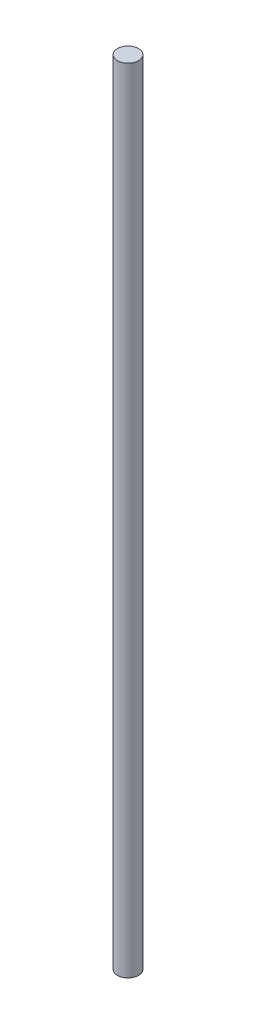
ISO-10303-21;
HEADER;
FILE_DESCRIPTION(('STEP AP214'),'2;1');
FILE_NAME('part.step','',(''),(''),'','','');
FILE_SCHEMA(('AUTOMOTIVE_DESIGN { 1 0 10303 214 1 1 1 1 }'));
ENDSEC;
DATA;
#1=APPLICATION_CONTEXT('core data for automotive mechanical design processes');
#2=APPLICATION_PROTOCOL_DEFINITION('international standard','automotive_design',2000,#1);
#3=PRODUCT_CONTEXT('',#1,'mechanical');
#4=PRODUCT('Part','Part','',(#3));
#5=PRODUCT_RELATED_PRODUCT_CATEGORY('part','',(#4));
#6=PRODUCT_DEFINITION_FORMATION('','',#4);
#7=PRODUCT_DEFINITION_CONTEXT('part definition',#1,'design');
#8=PRODUCT_DEFINITION('design','',#6,#7);
#9=PRODUCT_DEFINITION_SHAPE('','',#8);
#10=(LENGTH_UNIT() NAMED_UNIT(*) SI_UNIT(.MILLI.,.METRE.));
#11=(NAMED_UNIT(*) PLANE_ANGLE_UNIT() SI_UNIT($,.RADIAN.));
#12=(NAMED_UNIT(*) SI_UNIT($,.STERADIAN.) SOLID_ANGLE_UNIT());
#13=UNCERTAINTY_MEASURE_WITH_UNIT(LENGTH_MEASURE(1.E-05),#10,'distance_accuracy_value','');
#14=(GEOMETRIC_REPRESENTATION_CONTEXT(3) GLOBAL_UNCERTAINTY_ASSIGNED_CONTEXT((#13)) GLOBAL_UNIT_ASSIGNED_CONTEXT((#10,
#11,#12)) REPRESENTATION_CONTEXT('',''));
#15=CARTESIAN_POINT('',(0.,0.,0.));
#16=DIRECTION('',(0.,0.,1.));
#17=DIRECTION('',(1.,0.,0.));
#18=AXIS2_PLACEMENT_3D('',#15,#16,#17);
#19=CARTESIAN_POINT('',(150.,900.,-400.));
#20=DIRECTION('',(0.,-1.,0.));
#21=DIRECTION('',(0.,0.,-1.));
#22=AXIS2_PLACEMENT_3D('',#19,#20,#21);
#23=CYLINDRICAL_SURFACE('',#22,8.00000000000001);
#24=CARTESIAN_POINT('',(150.,900.,-400.));
#25=DIRECTION('',(0.,1.,0.));
#26=DIRECTION('',(0.,0.,1.));
#27=AXIS2_PLACEMENT_3D('',#24,#25,#26);
#28=CIRCLE('',#27,8.00000000000001);
#29=CARTESIAN_POINT('',(150.,900.,-392.));
#30=VERTEX_POINT('',#29);
#31=EDGE_CURVE('E10',#30,#30,#28,.T.);
#32=ORIENTED_EDGE('',*,*,#31,.F.);
#33=EDGE_LOOP('',(#32));
#34=FACE_BOUND('',#33,.T.);
#35=CARTESIAN_POINT('',(150.,300.,-400.));
#36=DIRECTION('',(0.,1.,0.));
#37=DIRECTION('',(0.,0.,1.));
#38=AXIS2_PLACEMENT_3D('',#35,#36,#37);
#39=CIRCLE('',#38,8.00000000000001);
#40=CARTESIAN_POINT('',(150.,300.,-392.));
#41=VERTEX_POINT('',#40);
#42=EDGE_CURVE('E40',#41,#41,#39,.T.);
#43=ORIENTED_EDGE('',*,*,#42,.T.);
#44=EDGE_LOOP('',(#43));
#45=FACE_BOUND('',#44,.T.);
#46=ADVANCED_FACE('F37',(#34,#45),#23,.T.);
#47=CARTESIAN_POINT('',(150.,900.,-400.));
#48=DIRECTION('',(0.,1.,0.));
#49=DIRECTION('',(0.,0.,1.));
#50=AXIS2_PLACEMENT_3D('',#47,#48,#49);
#51=PLANE('',#50);
#52=ORIENTED_EDGE('',*,*,#31,.T.);
#53=EDGE_LOOP('',(#52));
#54=FACE_BOUND('',#53,.T.);
#55=ADVANCED_FACE('F52',(#54),#51,.T.);
#56=CARTESIAN_POINT('',(150.,300.,-400.));
#57=DIRECTION('',(0.,1.,0.));
#58=DIRECTION('',(0.,0.,1.));
#59=AXIS2_PLACEMENT_3D('',#56,#57,#58);
#60=PLANE('',#59);
#61=ORIENTED_EDGE('',*,*,#42,.F.);
#62=EDGE_LOOP('',(#61));
#63=FACE_BOUND('',#62,.T.);
#64=ADVANCED_FACE('F50',(#63),#60,.F.);
#65=CLOSED_SHELL('',(#46,#55,#64));
#66=MANIFOLD_SOLID_BREP('B2',#65);
#67=ADVANCED_BREP_SHAPE_REPRESENTATION('',(#18,#66),#14);
#68=SHAPE_DEFINITION_REPRESENTATION(#9,#67);
ENDSEC;
END-ISO-10303-21;
